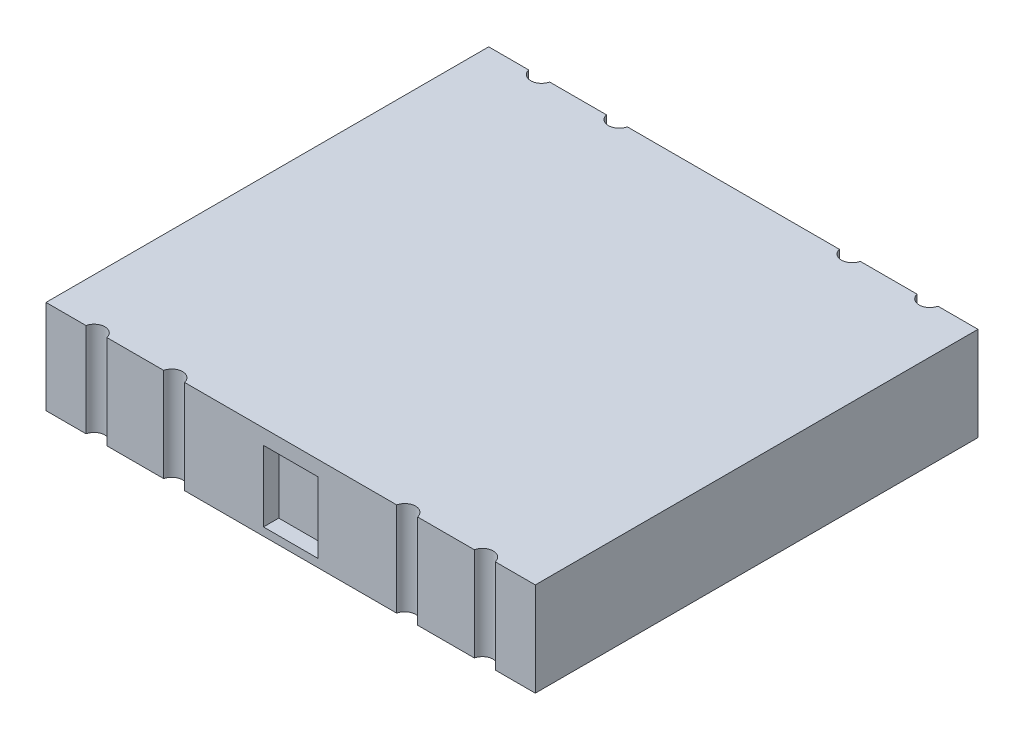
ISO-10303-21;
HEADER;
FILE_DESCRIPTION(('STEP AP214'),'2;1');
FILE_NAME('part.step','',(''),(''),'','','');
FILE_SCHEMA(('AUTOMOTIVE_DESIGN { 1 0 10303 214 1 1 1 1 }'));
ENDSEC;
DATA;
#1=APPLICATION_CONTEXT('core data for automotive mechanical design processes');
#2=APPLICATION_PROTOCOL_DEFINITION('international standard','automotive_design',2000,#1);
#3=PRODUCT_CONTEXT('',#1,'mechanical');
#4=PRODUCT('Part','Part','',(#3));
#5=PRODUCT_RELATED_PRODUCT_CATEGORY('part','',(#4));
#6=PRODUCT_DEFINITION_FORMATION('','',#4);
#7=PRODUCT_DEFINITION_CONTEXT('part definition',#1,'design');
#8=PRODUCT_DEFINITION('design','',#6,#7);
#9=PRODUCT_DEFINITION_SHAPE('','',#8);
#10=(LENGTH_UNIT() NAMED_UNIT(*) SI_UNIT(.MILLI.,.METRE.));
#11=(NAMED_UNIT(*) PLANE_ANGLE_UNIT() SI_UNIT($,.RADIAN.));
#12=(NAMED_UNIT(*) SI_UNIT($,.STERADIAN.) SOLID_ANGLE_UNIT());
#13=UNCERTAINTY_MEASURE_WITH_UNIT(LENGTH_MEASURE(1.E-05),#10,'distance_accuracy_value','');
#14=(GEOMETRIC_REPRESENTATION_CONTEXT(3) GLOBAL_UNCERTAINTY_ASSIGNED_CONTEXT((#13)) GLOBAL_UNIT_ASSIGNED_CONTEXT((#10,
#11,#12)) REPRESENTATION_CONTEXT('',''));
#15=CARTESIAN_POINT('',(0.,0.,0.));
#16=DIRECTION('',(0.,0.,1.));
#17=DIRECTION('',(1.,0.,0.));
#18=AXIS2_PLACEMENT_3D('',#15,#16,#17);
#19=CARTESIAN_POINT('',(-0.889000000000037,21.4481407925516,-7.239));
#20=DIRECTION('',(1.,0.,0.));
#21=DIRECTION('',(0.,-1.,0.));
#22=AXIS2_PLACEMENT_3D('',#19,#20,#21);
#23=PLANE('',#22);
#24=DIRECTION('',(0.,0.,1.));
#25=VECTOR('',#24,1.);
#26=CARTESIAN_POINT('',(-0.889000000000037,2.4384,-7.239));
#27=LINE('',#26,#25);
#28=CARTESIAN_POINT('',(-0.889000000000037,2.4384,-7.239));
#29=VERTEX_POINT('',#28);
#30=CARTESIAN_POINT('',(-0.889000000000037,2.4384,-6.739));
#31=VERTEX_POINT('',#30);
#32=EDGE_CURVE('E11',#29,#31,#27,.T.);
#33=ORIENTED_EDGE('',*,*,#32,.T.);
#34=DIRECTION('',(0.,-1.,0.));
#35=VECTOR('',#34,1.);
#36=CARTESIAN_POINT('',(-0.889000000000037,21.4481407925516,-6.739));
#37=LINE('',#36,#35);
#38=CARTESIAN_POINT('',(-0.889000000000037,0.127000000000001,-6.739));
#39=VERTEX_POINT('',#38);
#40=EDGE_CURVE('E24',#31,#39,#37,.T.);
#41=ORIENTED_EDGE('',*,*,#40,.T.);
#42=DIRECTION('',(0.,0.,1.));
#43=VECTOR('',#42,1.);
#44=CARTESIAN_POINT('',(-0.889000000000037,0.127000000000001,-7.239));
#45=LINE('',#44,#43);
#46=CARTESIAN_POINT('',(-0.889000000000037,0.127000000000001,-7.239));
#47=VERTEX_POINT('',#46);
#48=EDGE_CURVE('E418',#47,#39,#45,.T.);
#49=ORIENTED_EDGE('',*,*,#48,.F.);
#50=DIRECTION('',(0.,-1.,0.));
#51=VECTOR('',#50,1.);
#52=CARTESIAN_POINT('',(-0.889000000000037,21.4481407925516,-7.239));
#53=LINE('',#52,#51);
#54=EDGE_CURVE('E415',#29,#47,#53,.T.);
#55=ORIENTED_EDGE('',*,*,#54,.F.);
#56=EDGE_LOOP('',(#33,#41,#49,#55));
#57=FACE_BOUND('',#56,.T.);
#58=ADVANCED_FACE('F17',(#57),#23,.T.);
#59=CARTESIAN_POINT('',(0.889000000000096,21.4481407925516,-7.239));
#60=DIRECTION('',(-1.,0.,0.));
#61=DIRECTION('',(0.,1.,0.));
#62=AXIS2_PLACEMENT_3D('',#59,#60,#61);
#63=PLANE('',#62);
#64=DIRECTION('',(0.,0.,-1.));
#65=VECTOR('',#64,1.);
#66=CARTESIAN_POINT('',(0.889000000000096,0.127000000000001,-7.239));
#67=LINE('',#66,#65);
#68=CARTESIAN_POINT('',(0.889000000000096,0.127000000000001,-6.739));
#69=VERTEX_POINT('',#68);
#70=CARTESIAN_POINT('',(0.889000000000096,0.127000000000001,-7.239));
#71=VERTEX_POINT('',#70);
#72=EDGE_CURVE('E413',#69,#71,#67,.T.);
#73=ORIENTED_EDGE('',*,*,#72,.F.);
#74=DIRECTION('',(0.,1.,0.));
#75=VECTOR('',#74,1.);
#76=CARTESIAN_POINT('',(0.889000000000096,21.4481407925516,-6.739));
#77=LINE('',#76,#75);
#78=CARTESIAN_POINT('',(0.889000000000096,2.4384,-6.739));
#79=VERTEX_POINT('',#78);
#80=EDGE_CURVE('E411',#69,#79,#77,.T.);
#81=ORIENTED_EDGE('',*,*,#80,.T.);
#82=DIRECTION('',(0.,0.,-1.));
#83=VECTOR('',#82,1.);
#84=CARTESIAN_POINT('',(0.889000000000096,2.4384,-7.239));
#85=LINE('',#84,#83);
#86=CARTESIAN_POINT('',(0.889000000000096,2.4384,-7.239));
#87=VERTEX_POINT('',#86);
#88=EDGE_CURVE('E409',#79,#87,#85,.T.);
#89=ORIENTED_EDGE('',*,*,#88,.T.);
#90=DIRECTION('',(0.,-1.,0.));
#91=VECTOR('',#90,1.);
#92=CARTESIAN_POINT('',(0.889000000000096,21.4481407925516,-7.239));
#93=LINE('',#92,#91);
#94=EDGE_CURVE('E406',#87,#71,#93,.T.);
#95=ORIENTED_EDGE('',*,*,#94,.T.);
#96=EDGE_LOOP('',(#73,#81,#89,#95));
#97=FACE_BOUND('',#96,.T.);
#98=ADVANCED_FACE('F429',(#97),#63,.T.);
#99=CARTESIAN_POINT('',(0.889000000000096,21.4481407925516,6.0950077317424));
#100=DIRECTION('',(-1.,0.,0.));
#101=DIRECTION('',(0.,1.,0.));
#102=AXIS2_PLACEMENT_3D('',#99,#100,#101);
#103=PLANE('',#102);
#104=DIRECTION('',(0.,0.,-1.));
#105=VECTOR('',#104,1.);
#106=CARTESIAN_POINT('',(0.889000000000096,2.4384,6.0950077317424));
#107=LINE('',#106,#105);
#108=CARTESIAN_POINT('',(0.889000000000096,2.4384,7.239));
#109=VERTEX_POINT('',#108);
#110=CARTESIAN_POINT('',(0.889000000000096,2.4384,6.739));
#111=VERTEX_POINT('',#110);
#112=EDGE_CURVE('E404',#109,#111,#107,.T.);
#113=ORIENTED_EDGE('',*,*,#112,.T.);
#114=DIRECTION('',(0.,-1.,0.));
#115=VECTOR('',#114,1.);
#116=CARTESIAN_POINT('',(0.889000000000096,21.4481407925516,6.739));
#117=LINE('',#116,#115);
#118=CARTESIAN_POINT('',(0.889000000000096,0.126999999999999,6.739));
#119=VERTEX_POINT('',#118);
#120=EDGE_CURVE('E402',#111,#119,#117,.T.);
#121=ORIENTED_EDGE('',*,*,#120,.T.);
#122=DIRECTION('',(0.,0.,-1.));
#123=VECTOR('',#122,1.);
#124=CARTESIAN_POINT('',(0.889000000000096,0.126999999999999,6.0950077317424));
#125=LINE('',#124,#123);
#126=CARTESIAN_POINT('',(0.889000000000096,0.126999999999999,7.239));
#127=VERTEX_POINT('',#126);
#128=EDGE_CURVE('E399',#127,#119,#125,.T.);
#129=ORIENTED_EDGE('',*,*,#128,.F.);
#130=DIRECTION('',(0.,-1.,0.));
#131=VECTOR('',#130,1.);
#132=CARTESIAN_POINT('',(0.889000000000096,21.4481407925516,7.239));
#133=LINE('',#132,#131);
#134=EDGE_CURVE('E396',#109,#127,#133,.T.);
#135=ORIENTED_EDGE('',*,*,#134,.F.);
#136=EDGE_LOOP('',(#113,#121,#129,#135));
#137=FACE_BOUND('',#136,.T.);
#138=ADVANCED_FACE('F453',(#137),#103,.T.);
#139=CARTESIAN_POINT('',(-0.889000000000037,21.4481407925516,6.0950077317424));
#140=DIRECTION('',(1.,0.,0.));
#141=DIRECTION('',(0.,-1.,0.));
#142=AXIS2_PLACEMENT_3D('',#139,#140,#141);
#143=PLANE('',#142);
#144=DIRECTION('',(0.,0.,1.));
#145=VECTOR('',#144,1.);
#146=CARTESIAN_POINT('',(-0.889000000000037,0.126999999999999,6.0950077317424));
#147=LINE('',#146,#145);
#148=CARTESIAN_POINT('',(-0.889000000000037,0.126999999999999,6.739));
#149=VERTEX_POINT('',#148);
#150=CARTESIAN_POINT('',(-0.889000000000037,0.126999999999999,7.239));
#151=VERTEX_POINT('',#150);
#152=EDGE_CURVE('E394',#149,#151,#147,.T.);
#153=ORIENTED_EDGE('',*,*,#152,.F.);
#154=DIRECTION('',(0.,1.,0.));
#155=VECTOR('',#154,1.);
#156=CARTESIAN_POINT('',(-0.889000000000037,21.4481407925516,6.739));
#157=LINE('',#156,#155);
#158=CARTESIAN_POINT('',(-0.889000000000037,2.4384,6.739));
#159=VERTEX_POINT('',#158);
#160=EDGE_CURVE('E392',#149,#159,#157,.T.);
#161=ORIENTED_EDGE('',*,*,#160,.T.);
#162=DIRECTION('',(0.,0.,1.));
#163=VECTOR('',#162,1.);
#164=CARTESIAN_POINT('',(-0.889000000000037,2.4384,6.0950077317424));
#165=LINE('',#164,#163);
#166=CARTESIAN_POINT('',(-0.889000000000037,2.4384,7.239));
#167=VERTEX_POINT('',#166);
#168=EDGE_CURVE('E390',#159,#167,#165,.T.);
#169=ORIENTED_EDGE('',*,*,#168,.T.);
#170=DIRECTION('',(0.,-1.,0.));
#171=VECTOR('',#170,1.);
#172=CARTESIAN_POINT('',(-0.889000000000037,21.4481407925516,7.239));
#173=LINE('',#172,#171);
#174=EDGE_CURVE('E387',#167,#151,#173,.T.);
#175=ORIENTED_EDGE('',*,*,#174,.T.);
#176=EDGE_LOOP('',(#153,#161,#169,#175));
#177=FACE_BOUND('',#176,.T.);
#178=ADVANCED_FACE('F457',(#177),#143,.T.);
#179=CARTESIAN_POINT('',(0.,0.127,0.));
#180=DIRECTION('',(0.,1.,0.));
#181=DIRECTION('',(1.,0.,0.));
#182=AXIS2_PLACEMENT_3D('',#179,#180,#181);
#183=PLANE('',#182);
#184=ORIENTED_EDGE('',*,*,#128,.T.);
#185=DIRECTION('',(1.,0.,0.));
#186=VECTOR('',#185,1.);
#187=CARTESIAN_POINT('',(-7.501,0.126999999999999,6.739));
#188=LINE('',#187,#186);
#189=EDGE_CURVE('E384',#149,#119,#188,.T.);
#190=ORIENTED_EDGE('',*,*,#189,.F.);
#191=ORIENTED_EDGE('',*,*,#152,.T.);
#192=DIRECTION('',(1.,0.,0.));
#193=VECTOR('',#192,1.);
#194=CARTESIAN_POINT('',(-0.889000000000037,0.126999999999999,7.239));
#195=LINE('',#194,#193);
#196=EDGE_CURVE('E381',#151,#127,#195,.T.);
#197=ORIENTED_EDGE('',*,*,#196,.T.);
#198=EDGE_LOOP('',(#184,#190,#191,#197));
#199=FACE_BOUND('',#198,.T.);
#200=ADVANCED_FACE('F463',(#199),#183,.T.);
#201=CARTESIAN_POINT('',(0.,0.127,0.));
#202=DIRECTION('',(0.,1.,0.));
#203=DIRECTION('',(1.,0.,0.));
#204=AXIS2_PLACEMENT_3D('',#201,#202,#203);
#205=PLANE('',#204);
#206=ORIENTED_EDGE('',*,*,#48,.T.);
#207=DIRECTION('',(-1.,0.,0.));
#208=VECTOR('',#207,1.);
#209=CARTESIAN_POINT('',(-7.501,0.127000000000001,-6.739));
#210=LINE('',#209,#208);
#211=EDGE_CURVE('E378',#69,#39,#210,.T.);
#212=ORIENTED_EDGE('',*,*,#211,.F.);
#213=ORIENTED_EDGE('',*,*,#72,.T.);
#214=DIRECTION('',(-1.,0.,0.));
#215=VECTOR('',#214,1.);
#216=CARTESIAN_POINT('',(-0.889000000000037,0.127000000000001,-7.239));
#217=LINE('',#216,#215);
#218=EDGE_CURVE('E375',#71,#47,#217,.T.);
#219=ORIENTED_EDGE('',*,*,#218,.T.);
#220=EDGE_LOOP('',(#206,#212,#213,#219));
#221=FACE_BOUND('',#220,.T.);
#222=ADVANCED_FACE('F423',(#221),#205,.T.);
#223=CARTESIAN_POINT('',(0.,2.4384,0.));
#224=DIRECTION('',(0.,1.,0.));
#225=DIRECTION('',(1.,0.,0.));
#226=AXIS2_PLACEMENT_3D('',#223,#224,#225);
#227=PLANE('',#226);
#228=DIRECTION('',(-1.,0.,0.));
#229=VECTOR('',#228,1.);
#230=CARTESIAN_POINT('',(0.,2.4384,6.739));
#231=LINE('',#230,#229);
#232=EDGE_CURVE('E372',#111,#159,#231,.T.);
#233=ORIENTED_EDGE('',*,*,#232,.F.);
#234=ORIENTED_EDGE('',*,*,#112,.F.);
#235=DIRECTION('',(1.,0.,0.));
#236=VECTOR('',#235,1.);
#237=CARTESIAN_POINT('',(-0.889000000000037,2.4384,7.239));
#238=LINE('',#237,#236);
#239=EDGE_CURVE('E369',#167,#109,#238,.T.);
#240=ORIENTED_EDGE('',*,*,#239,.F.);
#241=ORIENTED_EDGE('',*,*,#168,.F.);
#242=EDGE_LOOP('',(#233,#234,#240,#241));
#243=FACE_BOUND('',#242,.T.);
#244=ADVANCED_FACE('F470',(#243),#227,.F.);
#245=CARTESIAN_POINT('',(0.,2.4384,0.));
#246=DIRECTION('',(0.,1.,0.));
#247=DIRECTION('',(1.,0.,0.));
#248=AXIS2_PLACEMENT_3D('',#245,#246,#247);
#249=PLANE('',#248);
#250=DIRECTION('',(1.,0.,0.));
#251=VECTOR('',#250,1.);
#252=CARTESIAN_POINT('',(0.,2.4384,-6.739));
#253=LINE('',#252,#251);
#254=EDGE_CURVE('E366',#31,#79,#253,.T.);
#255=ORIENTED_EDGE('',*,*,#254,.F.);
#256=ORIENTED_EDGE('',*,*,#32,.F.);
#257=DIRECTION('',(-1.,0.,0.));
#258=VECTOR('',#257,1.);
#259=CARTESIAN_POINT('',(-0.889000000000037,2.4384,-7.239));
#260=LINE('',#259,#258);
#261=EDGE_CURVE('E363',#87,#29,#260,.T.);
#262=ORIENTED_EDGE('',*,*,#261,.F.);
#263=ORIENTED_EDGE('',*,*,#88,.F.);
#264=EDGE_LOOP('',(#255,#256,#262,#263));
#265=FACE_BOUND('',#264,.T.);
#266=ADVANCED_FACE('F431',(#265),#249,.F.);
#267=CARTESIAN_POINT('',(3.4683956089275,2.794,7.239));
#268=DIRECTION('',(0.,0.,-1.));
#269=DIRECTION('',(0.,1.,0.));
#270=AXIS2_PLACEMENT_3D('',#267,#268,#269);
#271=PLANE('',#270);
#272=DIRECTION('',(0.,-1.,0.));
#273=VECTOR('',#272,1.);
#274=CARTESIAN_POINT('',(-3.4683956089275,2.794,7.239));
#275=LINE('',#274,#273);
#276=CARTESIAN_POINT('',(-3.4683956089275,2.9306,7.239));
#277=VERTEX_POINT('',#276);
#278=CARTESIAN_POINT('',(-3.4683956089275,-0.136600000000001,7.239));
#279=VERTEX_POINT('',#278);
#280=EDGE_CURVE('E361',#277,#279,#275,.T.);
#281=ORIENTED_EDGE('',*,*,#280,.T.);
#282=DIRECTION('',(1.,0.,0.));
#283=VECTOR('',#282,1.);
#284=CARTESIAN_POINT('',(3.4683956089275,-0.136600000000001,7.239));
#285=LINE('',#284,#283);
#286=CARTESIAN_POINT('',(3.4683956089275,-0.136600000000001,7.239));
#287=VERTEX_POINT('',#286);
#288=EDGE_CURVE('E359',#279,#287,#285,.T.);
#289=ORIENTED_EDGE('',*,*,#288,.T.);
#290=DIRECTION('',(0.,-1.,0.));
#291=VECTOR('',#290,1.);
#292=CARTESIAN_POINT('',(3.4683956089275,2.794,7.239));
#293=LINE('',#292,#291);
#294=CARTESIAN_POINT('',(3.4683956089275,2.9306,7.239));
#295=VERTEX_POINT('',#294);
#296=EDGE_CURVE('E356',#295,#287,#293,.T.);
#297=ORIENTED_EDGE('',*,*,#296,.F.);
#298=DIRECTION('',(1.,0.,0.));
#299=VECTOR('',#298,1.);
#300=CARTESIAN_POINT('',(3.4683956089275,2.9306,7.239));
#301=LINE('',#300,#299);
#302=EDGE_CURVE('E353',#277,#295,#301,.T.);
#303=ORIENTED_EDGE('',*,*,#302,.F.);
#304=EDGE_LOOP('',(#281,#289,#297,#303));
#305=FACE_BOUND('',#304,.T.);
#306=ORIENTED_EDGE('',*,*,#196,.F.);
#307=ORIENTED_EDGE('',*,*,#174,.F.);
#308=ORIENTED_EDGE('',*,*,#239,.T.);
#309=ORIENTED_EDGE('',*,*,#134,.T.);
#310=EDGE_LOOP('',(#306,#307,#308,#309));
#311=FACE_BOUND('',#310,.T.);
#312=ADVANCED_FACE('F436',(#305,#311),#271,.F.);
#313=CARTESIAN_POINT('',(3.4683956089275,2.794,-7.239));
#314=DIRECTION('',(0.,0.,1.));
#315=DIRECTION('',(0.,-1.,0.));
#316=AXIS2_PLACEMENT_3D('',#313,#314,#315);
#317=PLANE('',#316);
#318=DIRECTION('',(0.,-1.,0.));
#319=VECTOR('',#318,1.);
#320=CARTESIAN_POINT('',(3.4683956089275,2.794,-7.239));
#321=LINE('',#320,#319);
#322=CARTESIAN_POINT('',(3.4683956089275,2.9306,-7.239));
#323=VERTEX_POINT('',#322);
#324=CARTESIAN_POINT('',(3.4683956089275,-0.136599999999999,-7.239));
#325=VERTEX_POINT('',#324);
#326=EDGE_CURVE('E351',#323,#325,#321,.T.);
#327=ORIENTED_EDGE('',*,*,#326,.T.);
#328=DIRECTION('',(-1.,0.,0.));
#329=VECTOR('',#328,1.);
#330=CARTESIAN_POINT('',(3.4683956089275,-0.136599999999999,-7.239));
#331=LINE('',#330,#329);
#332=CARTESIAN_POINT('',(-3.4683956089275,-0.136599999999999,-7.239));
#333=VERTEX_POINT('',#332);
#334=EDGE_CURVE('E349',#325,#333,#331,.T.);
#335=ORIENTED_EDGE('',*,*,#334,.T.);
#336=DIRECTION('',(0.,-1.,0.));
#337=VECTOR('',#336,1.);
#338=CARTESIAN_POINT('',(-3.4683956089275,2.794,-7.239));
#339=LINE('',#338,#337);
#340=CARTESIAN_POINT('',(-3.4683956089275,2.9306,-7.239));
#341=VERTEX_POINT('',#340);
#342=EDGE_CURVE('E346',#341,#333,#339,.T.);
#343=ORIENTED_EDGE('',*,*,#342,.F.);
#344=DIRECTION('',(-1.,0.,0.));
#345=VECTOR('',#344,1.);
#346=CARTESIAN_POINT('',(3.4683956089275,2.9306,-7.239));
#347=LINE('',#346,#345);
#348=EDGE_CURVE('E343',#323,#341,#347,.T.);
#349=ORIENTED_EDGE('',*,*,#348,.F.);
#350=EDGE_LOOP('',(#327,#335,#343,#349));
#351=FACE_BOUND('',#350,.T.);
#352=ORIENTED_EDGE('',*,*,#218,.F.);
#353=ORIENTED_EDGE('',*,*,#94,.F.);
#354=ORIENTED_EDGE('',*,*,#261,.T.);
#355=ORIENTED_EDGE('',*,*,#54,.T.);
#356=EDGE_LOOP('',(#352,#353,#354,#355));
#357=FACE_BOUND('',#356,.T.);
#358=ADVANCED_FACE('F433',(#351,#357),#317,.F.);
#359=CARTESIAN_POINT('',(-6.35,2.794,7.3151999999999));
#360=DIRECTION('',(0.,-1.,0.));
#361=DIRECTION('',(-1.,0.,0.));
#362=AXIS2_PLACEMENT_3D('',#359,#360,#361);
#363=CYLINDRICAL_SURFACE('',#362,0.35);
#364=DIRECTION('',(0.,-1.,0.));
#365=VECTOR('',#364,1.);
#366=CARTESIAN_POINT('',(-6.6916043910725,2.794,7.239));
#367=LINE('',#366,#365);
#368=CARTESIAN_POINT('',(-6.6916043910725,2.9306,7.239));
#369=VERTEX_POINT('',#368);
#370=CARTESIAN_POINT('',(-6.6916043910725,-0.136600000000001,7.239));
#371=VERTEX_POINT('',#370);
#372=EDGE_CURVE('E222',#369,#371,#367,.T.);
#373=ORIENTED_EDGE('',*,*,#372,.T.);
#374=CARTESIAN_POINT('',(-6.35,-0.136600000000001,7.3151999999999));
#375=DIRECTION('',(0.,-1.,0.));
#376=DIRECTION('',(1.,0.,0.));
#377=AXIS2_PLACEMENT_3D('',#374,#375,#376);
#378=CIRCLE('',#377,0.35);
#379=CARTESIAN_POINT('',(-6.0083956089275,-0.136600000000001,7.239));
#380=VERTEX_POINT('',#379);
#381=EDGE_CURVE('E339',#371,#380,#378,.T.);
#382=ORIENTED_EDGE('',*,*,#381,.T.);
#383=DIRECTION('',(0.,-1.,0.));
#384=VECTOR('',#383,1.);
#385=CARTESIAN_POINT('',(-6.0083956089275,2.794,7.239));
#386=LINE('',#385,#384);
#387=CARTESIAN_POINT('',(-6.0083956089275,2.9306,7.239));
#388=VERTEX_POINT('',#387);
#389=EDGE_CURVE('E337',#388,#380,#386,.T.);
#390=ORIENTED_EDGE('',*,*,#389,.F.);
#391=CARTESIAN_POINT('',(-6.35,2.9306,7.3151999999999));
#392=DIRECTION('',(0.,-1.,0.));
#393=DIRECTION('',(1.,0.,0.));
#394=AXIS2_PLACEMENT_3D('',#391,#392,#393);
#395=CIRCLE('',#394,0.35);
#396=EDGE_CURVE('E335',#369,#388,#395,.T.);
#397=ORIENTED_EDGE('',*,*,#396,.F.);
#398=EDGE_LOOP('',(#373,#382,#390,#397));
#399=FACE_BOUND('',#398,.T.);
#400=ADVANCED_FACE('F435',(#399),#363,.F.);
#401=CARTESIAN_POINT('',(-4.1516043910725,2.794,7.239));
#402=DIRECTION('',(0.,0.,-1.));
#403=DIRECTION('',(0.,1.,0.));
#404=AXIS2_PLACEMENT_3D('',#401,#402,#403);
#405=PLANE('',#404);
#406=ORIENTED_EDGE('',*,*,#389,.T.);
#407=DIRECTION('',(1.,0.,0.));
#408=VECTOR('',#407,1.);
#409=CARTESIAN_POINT('',(-4.1516043910725,-0.136600000000001,7.239));
#410=LINE('',#409,#408);
#411=CARTESIAN_POINT('',(-4.1516043910725,-0.136600000000001,7.239));
#412=VERTEX_POINT('',#411);
#413=EDGE_CURVE('E333',#380,#412,#410,.T.);
#414=ORIENTED_EDGE('',*,*,#413,.T.);
#415=DIRECTION('',(0.,-1.,0.));
#416=VECTOR('',#415,1.);
#417=CARTESIAN_POINT('',(-4.1516043910725,2.794,7.239));
#418=LINE('',#417,#416);
#419=CARTESIAN_POINT('',(-4.1516043910725,2.9306,7.239));
#420=VERTEX_POINT('',#419);
#421=EDGE_CURVE('E330',#420,#412,#418,.T.);
#422=ORIENTED_EDGE('',*,*,#421,.F.);
#423=DIRECTION('',(1.,0.,0.));
#424=VECTOR('',#423,1.);
#425=CARTESIAN_POINT('',(-4.1516043910725,2.9306,7.239));
#426=LINE('',#425,#424);
#427=EDGE_CURVE('E327',#388,#420,#426,.T.);
#428=ORIENTED_EDGE('',*,*,#427,.F.);
#429=EDGE_LOOP('',(#406,#414,#422,#428));
#430=FACE_BOUND('',#429,.T.);
#431=ADVANCED_FACE('F444',(#430),#405,.F.);
#432=CARTESIAN_POINT('',(-3.81,2.794,7.3151999999999));
#433=DIRECTION('',(0.,-1.,0.));
#434=DIRECTION('',(-1.,0.,0.));
#435=AXIS2_PLACEMENT_3D('',#432,#433,#434);
#436=CYLINDRICAL_SURFACE('',#435,0.35);
#437=ORIENTED_EDGE('',*,*,#421,.T.);
#438=CARTESIAN_POINT('',(-3.81,-0.136600000000001,7.3151999999999));
#439=DIRECTION('',(0.,-1.,0.));
#440=DIRECTION('',(1.,0.,0.));
#441=AXIS2_PLACEMENT_3D('',#438,#439,#440);
#442=CIRCLE('',#441,0.350000000000001);
#443=EDGE_CURVE('E324',#412,#279,#442,.T.);
#444=ORIENTED_EDGE('',*,*,#443,.T.);
#445=ORIENTED_EDGE('',*,*,#280,.F.);
#446=CARTESIAN_POINT('',(-3.81,2.9306,7.3151999999999));
#447=DIRECTION('',(0.,-1.,0.));
#448=DIRECTION('',(1.,0.,0.));
#449=AXIS2_PLACEMENT_3D('',#446,#447,#448);
#450=CIRCLE('',#449,0.35);
#451=EDGE_CURVE('E321',#420,#277,#450,.T.);
#452=ORIENTED_EDGE('',*,*,#451,.F.);
#453=EDGE_LOOP('',(#437,#444,#445,#452));
#454=FACE_BOUND('',#453,.T.);
#455=ADVANCED_FACE('F510',(#454),#436,.F.);
#456=CARTESIAN_POINT('',(3.81,2.794,7.3151999999999));
#457=DIRECTION('',(0.,-1.,0.));
#458=DIRECTION('',(-1.,0.,0.));
#459=AXIS2_PLACEMENT_3D('',#456,#457,#458);
#460=CYLINDRICAL_SURFACE('',#459,0.35);
#461=ORIENTED_EDGE('',*,*,#296,.T.);
#462=CARTESIAN_POINT('',(3.81,-0.136600000000001,7.3151999999999));
#463=DIRECTION('',(0.,-1.,0.));
#464=DIRECTION('',(1.,0.,0.));
#465=AXIS2_PLACEMENT_3D('',#462,#463,#464);
#466=CIRCLE('',#465,0.350000000000001);
#467=CARTESIAN_POINT('',(4.1516043910725,-0.136600000000001,7.239));
#468=VERTEX_POINT('',#467);
#469=EDGE_CURVE('E318',#287,#468,#466,.T.);
#470=ORIENTED_EDGE('',*,*,#469,.T.);
#471=DIRECTION('',(0.,-1.,0.));
#472=VECTOR('',#471,1.);
#473=CARTESIAN_POINT('',(4.1516043910725,2.794,7.239));
#474=LINE('',#473,#472);
#475=CARTESIAN_POINT('',(4.1516043910725,2.9306,7.239));
#476=VERTEX_POINT('',#475);
#477=EDGE_CURVE('E316',#476,#468,#474,.T.);
#478=ORIENTED_EDGE('',*,*,#477,.F.);
#479=CARTESIAN_POINT('',(3.81,2.9306,7.3151999999999));
#480=DIRECTION('',(0.,-1.,0.));
#481=DIRECTION('',(1.,0.,0.));
#482=AXIS2_PLACEMENT_3D('',#479,#480,#481);
#483=CIRCLE('',#482,0.35);
#484=EDGE_CURVE('E314',#295,#476,#483,.T.);
#485=ORIENTED_EDGE('',*,*,#484,.F.);
#486=EDGE_LOOP('',(#461,#470,#478,#485));
#487=FACE_BOUND('',#486,.T.);
#488=ADVANCED_FACE('F520',(#487),#460,.F.);
#489=CARTESIAN_POINT('',(6.0083956089275,2.794,7.239));
#490=DIRECTION('',(0.,0.,-1.));
#491=DIRECTION('',(0.,1.,0.));
#492=AXIS2_PLACEMENT_3D('',#489,#490,#491);
#493=PLANE('',#492);
#494=ORIENTED_EDGE('',*,*,#477,.T.);
#495=DIRECTION('',(1.,0.,0.));
#496=VECTOR('',#495,1.);
#497=CARTESIAN_POINT('',(6.0083956089275,-0.136600000000001,7.239));
#498=LINE('',#497,#496);
#499=CARTESIAN_POINT('',(6.0083956089275,-0.136600000000001,7.239));
#500=VERTEX_POINT('',#499);
#501=EDGE_CURVE('E312',#468,#500,#498,.T.);
#502=ORIENTED_EDGE('',*,*,#501,.T.);
#503=DIRECTION('',(0.,-1.,0.));
#504=VECTOR('',#503,1.);
#505=CARTESIAN_POINT('',(6.0083956089275,2.794,7.239));
#506=LINE('',#505,#504);
#507=CARTESIAN_POINT('',(6.0083956089275,2.9306,7.239));
#508=VERTEX_POINT('',#507);
#509=EDGE_CURVE('E309',#508,#500,#506,.T.);
#510=ORIENTED_EDGE('',*,*,#509,.F.);
#511=DIRECTION('',(1.,0.,0.));
#512=VECTOR('',#511,1.);
#513=CARTESIAN_POINT('',(6.0083956089275,2.9306,7.239));
#514=LINE('',#513,#512);
#515=EDGE_CURVE('E306',#476,#508,#514,.T.);
#516=ORIENTED_EDGE('',*,*,#515,.F.);
#517=EDGE_LOOP('',(#494,#502,#510,#516));
#518=FACE_BOUND('',#517,.T.);
#519=ADVANCED_FACE('F530',(#518),#493,.F.);
#520=CARTESIAN_POINT('',(6.35,2.794,7.3151999999999));
#521=DIRECTION('',(0.,-1.,0.));
#522=DIRECTION('',(-1.,0.,0.));
#523=AXIS2_PLACEMENT_3D('',#520,#521,#522);
#524=CYLINDRICAL_SURFACE('',#523,0.35);
#525=ORIENTED_EDGE('',*,*,#509,.T.);
#526=CARTESIAN_POINT('',(6.35,-0.136600000000001,7.3151999999999));
#527=DIRECTION('',(0.,-1.,0.));
#528=DIRECTION('',(1.,0.,0.));
#529=AXIS2_PLACEMENT_3D('',#526,#527,#528);
#530=CIRCLE('',#529,0.35);
#531=CARTESIAN_POINT('',(6.6916043910725,-0.136600000000001,7.239));
#532=VERTEX_POINT('',#531);
#533=EDGE_CURVE('E303',#500,#532,#530,.T.);
#534=ORIENTED_EDGE('',*,*,#533,.T.);
#535=DIRECTION('',(0.,-1.,0.));
#536=VECTOR('',#535,1.);
#537=CARTESIAN_POINT('',(6.6916043910725,2.794,7.239));
#538=LINE('',#537,#536);
#539=CARTESIAN_POINT('',(6.6916043910725,2.9306,7.239));
#540=VERTEX_POINT('',#539);
#541=EDGE_CURVE('E301',#540,#532,#538,.T.);
#542=ORIENTED_EDGE('',*,*,#541,.F.);
#543=CARTESIAN_POINT('',(6.35,2.9306,7.3151999999999));
#544=DIRECTION('',(0.,-1.,0.));
#545=DIRECTION('',(1.,0.,0.));
#546=AXIS2_PLACEMENT_3D('',#543,#544,#545);
#547=CIRCLE('',#546,0.349999999999999);
#548=EDGE_CURVE('E299',#508,#540,#547,.T.);
#549=ORIENTED_EDGE('',*,*,#548,.F.);
#550=EDGE_LOOP('',(#525,#534,#542,#549));
#551=FACE_BOUND('',#550,.T.);
#552=ADVANCED_FACE('F540',(#551),#524,.F.);
#553=CARTESIAN_POINT('',(8.001,2.794,7.239));
#554=DIRECTION('',(0.,0.,-1.));
#555=DIRECTION('',(0.,1.,0.));
#556=AXIS2_PLACEMENT_3D('',#553,#554,#555);
#557=PLANE('',#556);
#558=ORIENTED_EDGE('',*,*,#541,.T.);
#559=DIRECTION('',(1.,0.,0.));
#560=VECTOR('',#559,1.);
#561=CARTESIAN_POINT('',(8.001,-0.136600000000001,7.239));
#562=LINE('',#561,#560);
#563=CARTESIAN_POINT('',(8.001,-0.136600000000001,7.239));
#564=VERTEX_POINT('',#563);
#565=EDGE_CURVE('E297',#532,#564,#562,.T.);
#566=ORIENTED_EDGE('',*,*,#565,.T.);
#567=DIRECTION('',(0.,-1.,0.));
#568=VECTOR('',#567,1.);
#569=CARTESIAN_POINT('',(8.001,2.794,7.239));
#570=LINE('',#569,#568);
#571=CARTESIAN_POINT('',(8.001,2.9306,7.239));
#572=VERTEX_POINT('',#571);
#573=EDGE_CURVE('E294',#572,#564,#570,.T.);
#574=ORIENTED_EDGE('',*,*,#573,.F.);
#575=DIRECTION('',(1.,0.,0.));
#576=VECTOR('',#575,1.);
#577=CARTESIAN_POINT('',(8.001,2.9306,7.239));
#578=LINE('',#577,#576);
#579=EDGE_CURVE('E291',#540,#572,#578,.T.);
#580=ORIENTED_EDGE('',*,*,#579,.F.);
#581=EDGE_LOOP('',(#558,#566,#574,#580));
#582=FACE_BOUND('',#581,.T.);
#583=ADVANCED_FACE('F550',(#582),#557,.F.);
#584=CARTESIAN_POINT('',(8.001,2.794,-7.239));
#585=DIRECTION('',(-1.,0.,0.));
#586=DIRECTION('',(0.,1.,0.));
#587=AXIS2_PLACEMENT_3D('',#584,#585,#586);
#588=PLANE('',#587);
#589=ORIENTED_EDGE('',*,*,#573,.T.);
#590=DIRECTION('',(0.,0.,-1.));
#591=VECTOR('',#590,1.);
#592=CARTESIAN_POINT('',(8.001,-0.136599999999999,-7.239));
#593=LINE('',#592,#591);
#594=CARTESIAN_POINT('',(8.001,-0.136599999999999,-7.239));
#595=VERTEX_POINT('',#594);
#596=EDGE_CURVE('E289',#564,#595,#593,.T.);
#597=ORIENTED_EDGE('',*,*,#596,.T.);
#598=DIRECTION('',(0.,-1.,0.));
#599=VECTOR('',#598,1.);
#600=CARTESIAN_POINT('',(8.001,2.794,-7.239));
#601=LINE('',#600,#599);
#602=CARTESIAN_POINT('',(8.001,2.9306,-7.239));
#603=VERTEX_POINT('',#602);
#604=EDGE_CURVE('E286',#603,#595,#601,.T.);
#605=ORIENTED_EDGE('',*,*,#604,.F.);
#606=DIRECTION('',(0.,0.,-1.));
#607=VECTOR('',#606,1.);
#608=CARTESIAN_POINT('',(8.001,2.9306,-7.239));
#609=LINE('',#608,#607);
#610=EDGE_CURVE('E283',#572,#603,#609,.T.);
#611=ORIENTED_EDGE('',*,*,#610,.F.);
#612=EDGE_LOOP('',(#589,#597,#605,#611));
#613=FACE_BOUND('',#612,.T.);
#614=ADVANCED_FACE('F560',(#613),#588,.F.);
#615=CARTESIAN_POINT('',(8.001,2.794,-7.239));
#616=DIRECTION('',(0.,0.,1.));
#617=DIRECTION('',(0.,-1.,0.));
#618=AXIS2_PLACEMENT_3D('',#615,#616,#617);
#619=PLANE('',#618);
#620=ORIENTED_EDGE('',*,*,#604,.T.);
#621=DIRECTION('',(-1.,0.,0.));
#622=VECTOR('',#621,1.);
#623=CARTESIAN_POINT('',(8.001,-0.136599999999999,-7.239));
#624=LINE('',#623,#622);
#625=CARTESIAN_POINT('',(6.6916043910725,-0.136599999999999,-7.239));
#626=VERTEX_POINT('',#625);
#627=EDGE_CURVE('E281',#595,#626,#624,.T.);
#628=ORIENTED_EDGE('',*,*,#627,.T.);
#629=DIRECTION('',(0.,-1.,0.));
#630=VECTOR('',#629,1.);
#631=CARTESIAN_POINT('',(6.6916043910725,2.794,-7.239));
#632=LINE('',#631,#630);
#633=CARTESIAN_POINT('',(6.6916043910725,2.9306,-7.239));
#634=VERTEX_POINT('',#633);
#635=EDGE_CURVE('E278',#634,#626,#632,.T.);
#636=ORIENTED_EDGE('',*,*,#635,.F.);
#637=DIRECTION('',(-1.,0.,0.));
#638=VECTOR('',#637,1.);
#639=CARTESIAN_POINT('',(8.001,2.9306,-7.239));
#640=LINE('',#639,#638);
#641=EDGE_CURVE('E275',#603,#634,#640,.T.);
#642=ORIENTED_EDGE('',*,*,#641,.F.);
#643=EDGE_LOOP('',(#620,#628,#636,#642));
#644=FACE_BOUND('',#643,.T.);
#645=ADVANCED_FACE('F570',(#644),#619,.F.);
#646=CARTESIAN_POINT('',(6.35,2.794,-7.3151999999999));
#647=DIRECTION('',(0.,-1.,0.));
#648=DIRECTION('',(-1.,0.,0.));
#649=AXIS2_PLACEMENT_3D('',#646,#647,#648);
#650=CYLINDRICAL_SURFACE('',#649,0.35);
#651=ORIENTED_EDGE('',*,*,#635,.T.);
#652=CARTESIAN_POINT('',(6.35,-0.136599999999999,-7.3151999999999));
#653=DIRECTION('',(0.,-1.,0.));
#654=DIRECTION('',(1.,0.,0.));
#655=AXIS2_PLACEMENT_3D('',#652,#653,#654);
#656=CIRCLE('',#655,0.349999999999999);
#657=CARTESIAN_POINT('',(6.0083956089275,-0.136599999999999,-7.239));
#658=VERTEX_POINT('',#657);
#659=EDGE_CURVE('E272',#626,#658,#656,.T.);
#660=ORIENTED_EDGE('',*,*,#659,.T.);
#661=DIRECTION('',(0.,-1.,0.));
#662=VECTOR('',#661,1.);
#663=CARTESIAN_POINT('',(6.0083956089275,2.794,-7.239));
#664=LINE('',#663,#662);
#665=CARTESIAN_POINT('',(6.0083956089275,2.9306,-7.239));
#666=VERTEX_POINT('',#665);
#667=EDGE_CURVE('E270',#666,#658,#664,.T.);
#668=ORIENTED_EDGE('',*,*,#667,.F.);
#669=CARTESIAN_POINT('',(6.35,2.9306,-7.3151999999999));
#670=DIRECTION('',(0.,-1.,0.));
#671=DIRECTION('',(1.,0.,0.));
#672=AXIS2_PLACEMENT_3D('',#669,#670,#671);
#673=CIRCLE('',#672,0.350000000000002);
#674=EDGE_CURVE('E268',#634,#666,#673,.T.);
#675=ORIENTED_EDGE('',*,*,#674,.F.);
#676=EDGE_LOOP('',(#651,#660,#668,#675));
#677=FACE_BOUND('',#676,.T.);
#678=ADVANCED_FACE('F580',(#677),#650,.F.);
#679=CARTESIAN_POINT('',(6.0083956089275,2.794,-7.239));
#680=DIRECTION('',(0.,0.,1.));
#681=DIRECTION('',(0.,-1.,0.));
#682=AXIS2_PLACEMENT_3D('',#679,#680,#681);
#683=PLANE('',#682);
#684=ORIENTED_EDGE('',*,*,#667,.T.);
#685=DIRECTION('',(-1.,0.,0.));
#686=VECTOR('',#685,1.);
#687=CARTESIAN_POINT('',(6.0083956089275,-0.136599999999999,-7.239));
#688=LINE('',#687,#686);
#689=CARTESIAN_POINT('',(4.1516043910725,-0.136599999999999,-7.239));
#690=VERTEX_POINT('',#689);
#691=EDGE_CURVE('E266',#658,#690,#688,.T.);
#692=ORIENTED_EDGE('',*,*,#691,.T.);
#693=DIRECTION('',(0.,-1.,0.));
#694=VECTOR('',#693,1.);
#695=CARTESIAN_POINT('',(4.1516043910725,2.794,-7.239));
#696=LINE('',#695,#694);
#697=CARTESIAN_POINT('',(4.1516043910725,2.9306,-7.239));
#698=VERTEX_POINT('',#697);
#699=EDGE_CURVE('E263',#698,#690,#696,.T.);
#700=ORIENTED_EDGE('',*,*,#699,.F.);
#701=DIRECTION('',(-1.,0.,0.));
#702=VECTOR('',#701,1.);
#703=CARTESIAN_POINT('',(6.0083956089275,2.9306,-7.239));
#704=LINE('',#703,#702);
#705=EDGE_CURVE('E260',#666,#698,#704,.T.);
#706=ORIENTED_EDGE('',*,*,#705,.F.);
#707=EDGE_LOOP('',(#684,#692,#700,#706));
#708=FACE_BOUND('',#707,.T.);
#709=ADVANCED_FACE('F590',(#708),#683,.F.);
#710=CARTESIAN_POINT('',(3.81,2.794,-7.3151999999999));
#711=DIRECTION('',(0.,-1.,0.));
#712=DIRECTION('',(-1.,0.,0.));
#713=AXIS2_PLACEMENT_3D('',#710,#711,#712);
#714=CYLINDRICAL_SURFACE('',#713,0.35);
#715=ORIENTED_EDGE('',*,*,#699,.T.);
#716=CARTESIAN_POINT('',(3.81,-0.136599999999999,-7.3151999999999));
#717=DIRECTION('',(0.,-1.,0.));
#718=DIRECTION('',(1.,0.,0.));
#719=AXIS2_PLACEMENT_3D('',#716,#717,#718);
#720=CIRCLE('',#719,0.35);
#721=EDGE_CURVE('E257',#690,#325,#720,.T.);
#722=ORIENTED_EDGE('',*,*,#721,.T.);
#723=ORIENTED_EDGE('',*,*,#326,.F.);
#724=CARTESIAN_POINT('',(3.81,2.9306,-7.3151999999999));
#725=DIRECTION('',(0.,-1.,0.));
#726=DIRECTION('',(1.,0.,0.));
#727=AXIS2_PLACEMENT_3D('',#724,#725,#726);
#728=CIRCLE('',#727,0.350000000000004);
#729=EDGE_CURVE('E254',#698,#323,#728,.T.);
#730=ORIENTED_EDGE('',*,*,#729,.F.);
#731=EDGE_LOOP('',(#715,#722,#723,#730));
#732=FACE_BOUND('',#731,.T.);
#733=ADVANCED_FACE('F600',(#732),#714,.F.);
#734=CARTESIAN_POINT('',(-3.81,2.794,-7.3151999999999));
#735=DIRECTION('',(0.,-1.,0.));
#736=DIRECTION('',(-1.,0.,0.));
#737=AXIS2_PLACEMENT_3D('',#734,#735,#736);
#738=CYLINDRICAL_SURFACE('',#737,0.35);
#739=ORIENTED_EDGE('',*,*,#342,.T.);
#740=CARTESIAN_POINT('',(-3.81,-0.136599999999999,-7.3151999999999));
#741=DIRECTION('',(0.,-1.,0.));
#742=DIRECTION('',(1.,0.,0.));
#743=AXIS2_PLACEMENT_3D('',#740,#741,#742);
#744=CIRCLE('',#743,0.35);
#745=CARTESIAN_POINT('',(-4.1516043910725,-0.136599999999999,-7.239));
#746=VERTEX_POINT('',#745);
#747=EDGE_CURVE('E251',#333,#746,#744,.T.);
#748=ORIENTED_EDGE('',*,*,#747,.T.);
#749=DIRECTION('',(0.,-1.,0.));
#750=VECTOR('',#749,1.);
#751=CARTESIAN_POINT('',(-4.1516043910725,2.794,-7.239));
#752=LINE('',#751,#750);
#753=CARTESIAN_POINT('',(-4.1516043910725,2.9306,-7.239));
#754=VERTEX_POINT('',#753);
#755=EDGE_CURVE('E249',#754,#746,#752,.T.);
#756=ORIENTED_EDGE('',*,*,#755,.F.);
#757=CARTESIAN_POINT('',(-3.81,2.9306,-7.3151999999999));
#758=DIRECTION('',(0.,-1.,0.));
#759=DIRECTION('',(1.,0.,0.));
#760=AXIS2_PLACEMENT_3D('',#757,#758,#759);
#761=CIRCLE('',#760,0.350000000000003);
#762=EDGE_CURVE('E247',#341,#754,#761,.T.);
#763=ORIENTED_EDGE('',*,*,#762,.F.);
#764=EDGE_LOOP('',(#739,#748,#756,#763));
#765=FACE_BOUND('',#764,.T.);
#766=ADVANCED_FACE('F610',(#765),#738,.F.);
#767=CARTESIAN_POINT('',(-4.1516043910725,2.794,-7.239));
#768=DIRECTION('',(0.,0.,1.));
#769=DIRECTION('',(0.,-1.,0.));
#770=AXIS2_PLACEMENT_3D('',#767,#768,#769);
#771=PLANE('',#770);
#772=ORIENTED_EDGE('',*,*,#755,.T.);
#773=DIRECTION('',(-1.,0.,0.));
#774=VECTOR('',#773,1.);
#775=CARTESIAN_POINT('',(-4.1516043910725,-0.136599999999999,-7.239));
#776=LINE('',#775,#774);
#777=CARTESIAN_POINT('',(-6.0083956089275,-0.136599999999999,-7.239));
#778=VERTEX_POINT('',#777);
#779=EDGE_CURVE('E245',#746,#778,#776,.T.);
#780=ORIENTED_EDGE('',*,*,#779,.T.);
#781=DIRECTION('',(0.,-1.,0.));
#782=VECTOR('',#781,1.);
#783=CARTESIAN_POINT('',(-6.0083956089275,2.794,-7.239));
#784=LINE('',#783,#782);
#785=CARTESIAN_POINT('',(-6.0083956089275,2.9306,-7.239));
#786=VERTEX_POINT('',#785);
#787=EDGE_CURVE('E242',#786,#778,#784,.T.);
#788=ORIENTED_EDGE('',*,*,#787,.F.);
#789=DIRECTION('',(-1.,0.,0.));
#790=VECTOR('',#789,1.);
#791=CARTESIAN_POINT('',(-4.1516043910725,2.9306,-7.239));
#792=LINE('',#791,#790);
#793=EDGE_CURVE('E239',#754,#786,#792,.T.);
#794=ORIENTED_EDGE('',*,*,#793,.F.);
#795=EDGE_LOOP('',(#772,#780,#788,#794));
#796=FACE_BOUND('',#795,.T.);
#797=ADVANCED_FACE('F620',(#796),#771,.F.);
#798=CARTESIAN_POINT('',(-6.35,2.794,-7.3151999999999));
#799=DIRECTION('',(0.,-1.,0.));
#800=DIRECTION('',(-1.,0.,0.));
#801=AXIS2_PLACEMENT_3D('',#798,#799,#800);
#802=CYLINDRICAL_SURFACE('',#801,0.35);
#803=ORIENTED_EDGE('',*,*,#787,.T.);
#804=CARTESIAN_POINT('',(-6.35,-0.136599999999999,-7.3151999999999));
#805=DIRECTION('',(0.,-1.,0.));
#806=DIRECTION('',(1.,0.,0.));
#807=AXIS2_PLACEMENT_3D('',#804,#805,#806);
#808=CIRCLE('',#807,0.349999999999999);
#809=CARTESIAN_POINT('',(-6.6916043910725,-0.136599999999999,-7.239));
#810=VERTEX_POINT('',#809);
#811=EDGE_CURVE('E236',#778,#810,#808,.T.);
#812=ORIENTED_EDGE('',*,*,#811,.T.);
#813=DIRECTION('',(0.,-1.,0.));
#814=VECTOR('',#813,1.);
#815=CARTESIAN_POINT('',(-6.6916043910725,2.794,-7.239));
#816=LINE('',#815,#814);
#817=CARTESIAN_POINT('',(-6.6916043910725,2.9306,-7.239));
#818=VERTEX_POINT('',#817);
#819=EDGE_CURVE('E234',#818,#810,#816,.T.);
#820=ORIENTED_EDGE('',*,*,#819,.F.);
#821=CARTESIAN_POINT('',(-6.35,2.9306,-7.3151999999999));
#822=DIRECTION('',(0.,-1.,0.));
#823=DIRECTION('',(1.,0.,0.));
#824=AXIS2_PLACEMENT_3D('',#821,#822,#823);
#825=CIRCLE('',#824,0.350000000000003);
#826=EDGE_CURVE('E232',#786,#818,#825,.T.);
#827=ORIENTED_EDGE('',*,*,#826,.F.);
#828=EDGE_LOOP('',(#803,#812,#820,#827));
#829=FACE_BOUND('',#828,.T.);
#830=ADVANCED_FACE('F630',(#829),#802,.F.);
#831=CARTESIAN_POINT('',(-6.6916043910725,2.794,-7.239));
#832=DIRECTION('',(0.,0.,1.));
#833=DIRECTION('',(0.,-1.,0.));
#834=AXIS2_PLACEMENT_3D('',#831,#832,#833);
#835=PLANE('',#834);
#836=ORIENTED_EDGE('',*,*,#819,.T.);
#837=DIRECTION('',(-1.,0.,0.));
#838=VECTOR('',#837,1.);
#839=CARTESIAN_POINT('',(-6.6916043910725,-0.136599999999999,-7.239));
#840=LINE('',#839,#838);
#841=CARTESIAN_POINT('',(-8.001,-0.136599999999999,-7.239));
#842=VERTEX_POINT('',#841);
#843=EDGE_CURVE('E230',#810,#842,#840,.T.);
#844=ORIENTED_EDGE('',*,*,#843,.T.);
#845=DIRECTION('',(0.,-1.,0.));
#846=VECTOR('',#845,1.);
#847=CARTESIAN_POINT('',(-8.001,2.794,-7.239));
#848=LINE('',#847,#846);
#849=CARTESIAN_POINT('',(-8.001,2.9306,-7.239));
#850=VERTEX_POINT('',#849);
#851=EDGE_CURVE('E228',#850,#842,#848,.T.);
#852=ORIENTED_EDGE('',*,*,#851,.F.);
#853=DIRECTION('',(-1.,0.,0.));
#854=VECTOR('',#853,1.);
#855=CARTESIAN_POINT('',(-6.6916043910725,2.9306,-7.239));
#856=LINE('',#855,#854);
#857=EDGE_CURVE('E216',#818,#850,#856,.T.);
#858=ORIENTED_EDGE('',*,*,#857,.F.);
#859=EDGE_LOOP('',(#836,#844,#852,#858));
#860=FACE_BOUND('',#859,.T.);
#861=ADVANCED_FACE('F640',(#860),#835,.F.);
#862=CARTESIAN_POINT('',(-8.001,2.794,7.239));
#863=DIRECTION('',(1.,0.,0.));
#864=DIRECTION('',(0.,-1.,0.));
#865=AXIS2_PLACEMENT_3D('',#862,#863,#864);
#866=PLANE('',#865);
#867=ORIENTED_EDGE('',*,*,#851,.T.);
#868=DIRECTION('',(0.,0.,1.));
#869=VECTOR('',#868,1.);
#870=CARTESIAN_POINT('',(-8.001,-0.136600000000001,7.239));
#871=LINE('',#870,#869);
#872=CARTESIAN_POINT('',(-8.001,-0.136600000000001,7.239));
#873=VERTEX_POINT('',#872);
#874=EDGE_CURVE('E204',#842,#873,#871,.T.);
#875=ORIENTED_EDGE('',*,*,#874,.T.);
#876=DIRECTION('',(0.,-1.,0.));
#877=VECTOR('',#876,1.);
#878=CARTESIAN_POINT('',(-8.001,2.794,7.239));
#879=LINE('',#878,#877);
#880=CARTESIAN_POINT('',(-8.001,2.9306,7.239));
#881=VERTEX_POINT('',#880);
#882=EDGE_CURVE('E198',#881,#873,#879,.T.);
#883=ORIENTED_EDGE('',*,*,#882,.F.);
#884=DIRECTION('',(0.,0.,1.));
#885=VECTOR('',#884,1.);
#886=CARTESIAN_POINT('',(-8.001,2.9306,7.239));
#887=LINE('',#886,#885);
#888=EDGE_CURVE('E202',#850,#881,#887,.T.);
#889=ORIENTED_EDGE('',*,*,#888,.F.);
#890=EDGE_LOOP('',(#867,#875,#883,#889));
#891=FACE_BOUND('',#890,.T.);
#892=ADVANCED_FACE('F201',(#891),#866,.F.);
#893=CARTESIAN_POINT('',(-6.6916043910725,2.794,7.239));
#894=DIRECTION('',(0.,0.,-1.));
#895=DIRECTION('',(0.,1.,0.));
#896=AXIS2_PLACEMENT_3D('',#893,#894,#895);
#897=PLANE('',#896);
#898=ORIENTED_EDGE('',*,*,#882,.T.);
#899=DIRECTION('',(1.,0.,0.));
#900=VECTOR('',#899,1.);
#901=CARTESIAN_POINT('',(-6.6916043910725,-0.136600000000001,7.239));
#902=LINE('',#901,#900);
#903=EDGE_CURVE('E217',#873,#371,#902,.T.);
#904=ORIENTED_EDGE('',*,*,#903,.T.);
#905=ORIENTED_EDGE('',*,*,#372,.F.);
#906=DIRECTION('',(1.,0.,0.));
#907=VECTOR('',#906,1.);
#908=CARTESIAN_POINT('',(-6.6916043910725,2.9306,7.239));
#909=LINE('',#908,#907);
#910=EDGE_CURVE('E214',#881,#369,#909,.T.);
#911=ORIENTED_EDGE('',*,*,#910,.F.);
#912=EDGE_LOOP('',(#898,#904,#905,#911));
#913=FACE_BOUND('',#912,.T.);
#914=ADVANCED_FACE('F220',(#913),#897,.F.);
#915=CARTESIAN_POINT('',(-7.501,22.6056131936963,-6.739));
#916=DIRECTION('',(0.,0.,1.));
#917=DIRECTION('',(0.,-1.,0.));
#918=AXIS2_PLACEMENT_3D('',#915,#916,#917);
#919=PLANE('',#918);
#920=ORIENTED_EDGE('',*,*,#40,.F.);
#921=ORIENTED_EDGE('',*,*,#254,.T.);
#922=ORIENTED_EDGE('',*,*,#80,.F.);
#923=ORIENTED_EDGE('',*,*,#211,.T.);
#924=EDGE_LOOP('',(#920,#921,#922,#923));
#925=FACE_BOUND('',#924,.T.);
#926=ADVANCED_FACE('F426',(#925),#919,.F.);
#927=CARTESIAN_POINT('',(-7.501,22.6056131936963,6.739));
#928=DIRECTION('',(0.,0.,-1.));
#929=DIRECTION('',(0.,1.,0.));
#930=AXIS2_PLACEMENT_3D('',#927,#928,#929);
#931=PLANE('',#930);
#932=ORIENTED_EDGE('',*,*,#120,.F.);
#933=ORIENTED_EDGE('',*,*,#232,.T.);
#934=ORIENTED_EDGE('',*,*,#160,.F.);
#935=ORIENTED_EDGE('',*,*,#189,.T.);
#936=EDGE_LOOP('',(#932,#933,#934,#935));
#937=FACE_BOUND('',#936,.T.);
#938=ADVANCED_FACE('F675',(#937),#931,.F.);
#939=CARTESIAN_POINT('',(-6.35,-0.136600000000001,7.3151999999999));
#940=DIRECTION('',(0.,1.,0.));
#941=DIRECTION('',(1.,0.,0.));
#942=AXIS2_PLACEMENT_3D('',#939,#940,#941);
#943=PLANE('',#942);
#944=ORIENTED_EDGE('',*,*,#381,.F.);
#945=ORIENTED_EDGE('',*,*,#903,.F.);
#946=ORIENTED_EDGE('',*,*,#874,.F.);
#947=ORIENTED_EDGE('',*,*,#843,.F.);
#948=ORIENTED_EDGE('',*,*,#811,.F.);
#949=ORIENTED_EDGE('',*,*,#779,.F.);
#950=ORIENTED_EDGE('',*,*,#747,.F.);
#951=ORIENTED_EDGE('',*,*,#334,.F.);
#952=ORIENTED_EDGE('',*,*,#721,.F.);
#953=ORIENTED_EDGE('',*,*,#691,.F.);
#954=ORIENTED_EDGE('',*,*,#659,.F.);
#955=ORIENTED_EDGE('',*,*,#627,.F.);
#956=ORIENTED_EDGE('',*,*,#596,.F.);
#957=ORIENTED_EDGE('',*,*,#565,.F.);
#958=ORIENTED_EDGE('',*,*,#533,.F.);
#959=ORIENTED_EDGE('',*,*,#501,.F.);
#960=ORIENTED_EDGE('',*,*,#469,.F.);
#961=ORIENTED_EDGE('',*,*,#288,.F.);
#962=ORIENTED_EDGE('',*,*,#443,.F.);
#963=ORIENTED_EDGE('',*,*,#413,.F.);
#964=EDGE_LOOP('',(#944,#945,#946,#947,#948,#949,#950,#951,#952,#953,#954,#955,#956,#957,#958,
#959,#960,#961,#962,#963));
#965=FACE_BOUND('',#964,.T.);
#966=ADVANCED_FACE('F684',(#965),#943,.F.);
#967=CARTESIAN_POINT('',(-6.35,2.9306,7.3151999999999));
#968=DIRECTION('',(0.,1.,0.));
#969=DIRECTION('',(1.,0.,0.));
#970=AXIS2_PLACEMENT_3D('',#967,#968,#969);
#971=PLANE('',#970);
#972=ORIENTED_EDGE('',*,*,#396,.T.);
#973=ORIENTED_EDGE('',*,*,#427,.T.);
#974=ORIENTED_EDGE('',*,*,#451,.T.);
#975=ORIENTED_EDGE('',*,*,#302,.T.);
#976=ORIENTED_EDGE('',*,*,#484,.T.);
#977=ORIENTED_EDGE('',*,*,#515,.T.);
#978=ORIENTED_EDGE('',*,*,#548,.T.);
#979=ORIENTED_EDGE('',*,*,#579,.T.);
#980=ORIENTED_EDGE('',*,*,#610,.T.);
#981=ORIENTED_EDGE('',*,*,#641,.T.);
#982=ORIENTED_EDGE('',*,*,#674,.T.);
#983=ORIENTED_EDGE('',*,*,#705,.T.);
#984=ORIENTED_EDGE('',*,*,#729,.T.);
#985=ORIENTED_EDGE('',*,*,#348,.T.);
#986=ORIENTED_EDGE('',*,*,#762,.T.);
#987=ORIENTED_EDGE('',*,*,#793,.T.);
#988=ORIENTED_EDGE('',*,*,#826,.T.);
#989=ORIENTED_EDGE('',*,*,#857,.T.);
#990=ORIENTED_EDGE('',*,*,#888,.T.);
#991=ORIENTED_EDGE('',*,*,#910,.T.);
#992=EDGE_LOOP('',(#972,#973,#974,#975,#976,#977,#978,#979,#980,#981,#982,#983,#984,#985,#986,
#987,#988,#989,#990,#991));
#993=FACE_BOUND('',#992,.T.);
#994=ADVANCED_FACE('F213',(#993),#971,.T.);
#995=CLOSED_SHELL('',(#58,#98,#138,#178,#200,#222,#244,#266,#312,#358,#400,#431,#455,#488,#519,
#552,#583,#614,#645,#678,#709,#733,#766,#797,#830,#861,#892,#914,#926,#938,#966,#994));
#996=MANIFOLD_SOLID_BREP('B1',#995);
#997=ADVANCED_BREP_SHAPE_REPRESENTATION('',(#18,#996),#14);
#998=SHAPE_DEFINITION_REPRESENTATION(#9,#997);
ENDSEC;
END-ISO-10303-21;
